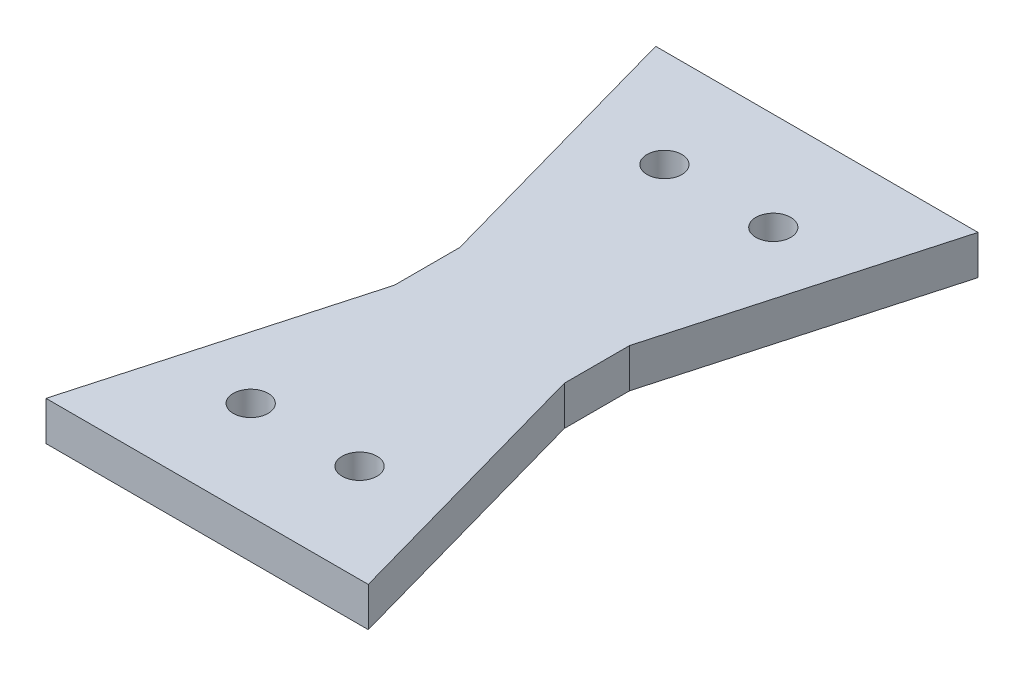
ISO-10303-21;
HEADER;
FILE_DESCRIPTION(('STEP AP214'),'2;1');
FILE_NAME('part.step','',(''),(''),'','','');
FILE_SCHEMA(('AUTOMOTIVE_DESIGN { 1 0 10303 214 1 1 1 1 }'));
ENDSEC;
DATA;
#1=APPLICATION_CONTEXT('core data for automotive mechanical design processes');
#2=APPLICATION_PROTOCOL_DEFINITION('international standard','automotive_design',2000,#1);
#3=PRODUCT_CONTEXT('',#1,'mechanical');
#4=PRODUCT('Part','Part','',(#3));
#5=PRODUCT_RELATED_PRODUCT_CATEGORY('part','',(#4));
#6=PRODUCT_DEFINITION_FORMATION('','',#4);
#7=PRODUCT_DEFINITION_CONTEXT('part definition',#1,'design');
#8=PRODUCT_DEFINITION('design','',#6,#7);
#9=PRODUCT_DEFINITION_SHAPE('','',#8);
#10=(LENGTH_UNIT() NAMED_UNIT(*) SI_UNIT(.MILLI.,.METRE.));
#11=(NAMED_UNIT(*) PLANE_ANGLE_UNIT() SI_UNIT($,.RADIAN.));
#12=(NAMED_UNIT(*) SI_UNIT($,.STERADIAN.) SOLID_ANGLE_UNIT());
#13=UNCERTAINTY_MEASURE_WITH_UNIT(LENGTH_MEASURE(1.E-05),#10,'distance_accuracy_value','');
#14=(GEOMETRIC_REPRESENTATION_CONTEXT(3) GLOBAL_UNCERTAINTY_ASSIGNED_CONTEXT((#13)) GLOBAL_UNIT_ASSIGNED_CONTEXT((#10,
#11,#12)) REPRESENTATION_CONTEXT('',''));
#15=CARTESIAN_POINT('',(0.,0.,0.));
#16=DIRECTION('',(0.,0.,1.));
#17=DIRECTION('',(1.,0.,0.));
#18=AXIS2_PLACEMENT_3D('',#15,#16,#17);
#19=CARTESIAN_POINT('',(0.,9.00000000000001,0.));
#20=DIRECTION('',(0.,-1.,0.));
#21=DIRECTION('',(0.,0.,-1.));
#22=AXIS2_PLACEMENT_3D('',#19,#20,#21);
#23=PLANE('',#22);
#24=DIRECTION('',(-1.,0.,0.));
#25=VECTOR('',#24,1.);
#26=CARTESIAN_POINT('',(-37.,9.00000000000001,-70.));
#27=LINE('',#26,#25);
#28=CARTESIAN_POINT('',(37.,9.00000000000001,-70.));
#29=VERTEX_POINT('',#28);
#30=CARTESIAN_POINT('',(-37.,9.00000000000001,-70.));
#31=VERTEX_POINT('',#30);
#32=EDGE_CURVE('E174',#29,#31,#27,.T.);
#33=ORIENTED_EDGE('',*,*,#32,.T.);
#34=DIRECTION('',(0.26962992551997,0.,0.962964019714182));
#35=VECTOR('',#34,1.);
#36=CARTESIAN_POINT('',(-37.,9.00000000000001,-70.));
#37=LINE('',#36,#35);
#38=CARTESIAN_POINT('',(-19.5,9.00000000000001,-7.50000000000001));
#39=VERTEX_POINT('',#38);
#40=EDGE_CURVE('E104',#31,#39,#37,.T.);
#41=ORIENTED_EDGE('',*,*,#40,.T.);
#42=DIRECTION('',(0.,0.,1.));
#43=VECTOR('',#42,1.);
#44=CARTESIAN_POINT('',(-19.5,9.00000000000001,-7.50000000000001));
#45=LINE('',#44,#43);
#46=CARTESIAN_POINT('',(-19.5,9.00000000000001,7.50000000000001));
#47=VERTEX_POINT('',#46);
#48=EDGE_CURVE('E196',#39,#47,#45,.T.);
#49=ORIENTED_EDGE('',*,*,#48,.T.);
#50=DIRECTION('',(-0.26962992551997,0.,0.962964019714182));
#51=VECTOR('',#50,1.);
#52=CARTESIAN_POINT('',(-30.,9.00000000000001,45.));
#53=LINE('',#52,#51);
#54=CARTESIAN_POINT('',(-37.,9.00000000000001,70.));
#55=VERTEX_POINT('',#54);
#56=EDGE_CURVE('E207',#47,#55,#53,.T.);
#57=ORIENTED_EDGE('',*,*,#56,.T.);
#58=DIRECTION('',(1.,0.,0.));
#59=VECTOR('',#58,1.);
#60=CARTESIAN_POINT('',(-37.,9.00000000000001,70.));
#61=LINE('',#60,#59);
#62=CARTESIAN_POINT('',(37.,9.00000000000001,70.));
#63=VERTEX_POINT('',#62);
#64=EDGE_CURVE('E124',#55,#63,#61,.T.);
#65=ORIENTED_EDGE('',*,*,#64,.T.);
#66=DIRECTION('',(-0.26962992551997,0.,-0.962964019714182));
#67=VECTOR('',#66,1.);
#68=CARTESIAN_POINT('',(37.,9.00000000000001,70.));
#69=LINE('',#68,#67);
#70=CARTESIAN_POINT('',(19.5,9.00000000000001,7.50000000000001));
#71=VERTEX_POINT('',#70);
#72=EDGE_CURVE('E117',#63,#71,#69,.T.);
#73=ORIENTED_EDGE('',*,*,#72,.T.);
#74=DIRECTION('',(0.,0.,-1.));
#75=VECTOR('',#74,1.);
#76=CARTESIAN_POINT('',(19.5,9.00000000000001,-7.50000000000001));
#77=LINE('',#76,#75);
#78=CARTESIAN_POINT('',(19.5,9.00000000000001,-7.50000000000001));
#79=VERTEX_POINT('',#78);
#80=EDGE_CURVE('E121',#71,#79,#77,.T.);
#81=ORIENTED_EDGE('',*,*,#80,.T.);
#82=DIRECTION('',(0.26962992551997,0.,-0.962964019714182));
#83=VECTOR('',#82,1.);
#84=CARTESIAN_POINT('',(30.,9.00000000000001,-45.));
#85=LINE('',#84,#83);
#86=EDGE_CURVE('E63',#79,#29,#85,.T.);
#87=ORIENTED_EDGE('',*,*,#86,.T.);
#88=EDGE_LOOP('',(#33,#41,#49,#57,#65,#73,#81,#87));
#89=FACE_BOUND('',#88,.T.);
#90=CARTESIAN_POINT('',(-12.5,9.00000000000001,-47.5));
#91=DIRECTION('',(0.,1.,0.));
#92=DIRECTION('',(0.,0.,1.));
#93=AXIS2_PLACEMENT_3D('',#90,#91,#92);
#94=CIRCLE('',#93,4.00000000000001);
#95=CARTESIAN_POINT('',(-12.5,9.00000000000001,-43.5));
#96=VERTEX_POINT('',#95);
#97=EDGE_CURVE('E153',#96,#96,#94,.T.);
#98=ORIENTED_EDGE('',*,*,#97,.F.);
#99=EDGE_LOOP('',(#98));
#100=FACE_BOUND('',#99,.T.);
#101=CARTESIAN_POINT('',(12.5,9.00000000000001,-47.5));
#102=DIRECTION('',(0.,1.,0.));
#103=DIRECTION('',(0.,0.,-1.));
#104=AXIS2_PLACEMENT_3D('',#101,#102,#103);
#105=CIRCLE('',#104,4.00000000000001);
#106=CARTESIAN_POINT('',(12.5,9.00000000000001,-51.5));
#107=VERTEX_POINT('',#106);
#108=EDGE_CURVE('E222',#107,#107,#105,.T.);
#109=ORIENTED_EDGE('',*,*,#108,.F.);
#110=EDGE_LOOP('',(#109));
#111=FACE_BOUND('',#110,.T.);
#112=CARTESIAN_POINT('',(12.5,9.00000000000001,47.5));
#113=DIRECTION('',(0.,1.,0.));
#114=DIRECTION('',(0.,0.,1.));
#115=AXIS2_PLACEMENT_3D('',#112,#113,#114);
#116=CIRCLE('',#115,4.00000000000001);
#117=CARTESIAN_POINT('',(12.5,9.00000000000001,51.5));
#118=VERTEX_POINT('',#117);
#119=EDGE_CURVE('E230',#118,#118,#116,.T.);
#120=ORIENTED_EDGE('',*,*,#119,.F.);
#121=EDGE_LOOP('',(#120));
#122=FACE_BOUND('',#121,.T.);
#123=CARTESIAN_POINT('',(-12.5,9.00000000000001,47.5));
#124=DIRECTION('',(0.,1.,0.));
#125=DIRECTION('',(0.,0.,-1.));
#126=AXIS2_PLACEMENT_3D('',#123,#124,#125);
#127=CIRCLE('',#126,4.00000000000001);
#128=CARTESIAN_POINT('',(-12.5,9.00000000000001,43.5));
#129=VERTEX_POINT('',#128);
#130=EDGE_CURVE('E238',#129,#129,#127,.T.);
#131=ORIENTED_EDGE('',*,*,#130,.F.);
#132=EDGE_LOOP('',(#131));
#133=FACE_BOUND('',#132,.T.);
#134=ADVANCED_FACE('F45',(#89,#100,#111,#122,#133),#23,.F.);
#135=CARTESIAN_POINT('',(0.,0.,0.));
#136=DIRECTION('',(0.,-1.,0.));
#137=DIRECTION('',(0.,0.,-1.));
#138=AXIS2_PLACEMENT_3D('',#135,#136,#137);
#139=PLANE('',#138);
#140=CARTESIAN_POINT('',(12.5,0.,47.5));
#141=DIRECTION('',(0.,1.,0.));
#142=DIRECTION('',(0.,0.,1.));
#143=AXIS2_PLACEMENT_3D('',#140,#141,#142);
#144=CIRCLE('',#143,4.00000000000001);
#145=CARTESIAN_POINT('',(12.5,0.,51.5));
#146=VERTEX_POINT('',#145);
#147=EDGE_CURVE('E234',#146,#146,#144,.T.);
#148=ORIENTED_EDGE('',*,*,#147,.T.);
#149=EDGE_LOOP('',(#148));
#150=FACE_BOUND('',#149,.T.);
#151=CARTESIAN_POINT('',(-12.5,0.,-47.5));
#152=DIRECTION('',(0.,1.,0.));
#153=DIRECTION('',(0.,0.,1.));
#154=AXIS2_PLACEMENT_3D('',#151,#152,#153);
#155=CIRCLE('',#154,4.00000000000001);
#156=CARTESIAN_POINT('',(-12.5,0.,-43.5));
#157=VERTEX_POINT('',#156);
#158=EDGE_CURVE('E218',#157,#157,#155,.T.);
#159=ORIENTED_EDGE('',*,*,#158,.T.);
#160=EDGE_LOOP('',(#159));
#161=FACE_BOUND('',#160,.T.);
#162=DIRECTION('',(-1.,0.,0.));
#163=VECTOR('',#162,1.);
#164=CARTESIAN_POINT('',(-37.,0.,-70.));
#165=LINE('',#164,#163);
#166=CARTESIAN_POINT('',(37.,0.,-70.));
#167=VERTEX_POINT('',#166);
#168=CARTESIAN_POINT('',(-37.,0.,-70.));
#169=VERTEX_POINT('',#168);
#170=EDGE_CURVE('E148',#167,#169,#165,.T.);
#171=ORIENTED_EDGE('',*,*,#170,.F.);
#172=DIRECTION('',(0.26962992551997,0.,-0.962964019714182));
#173=VECTOR('',#172,1.);
#174=CARTESIAN_POINT('',(37.,0.,-70.));
#175=LINE('',#174,#173);
#176=CARTESIAN_POINT('',(19.5,0.,-7.50000000000001));
#177=VERTEX_POINT('',#176);
#178=EDGE_CURVE('E92',#177,#167,#175,.T.);
#179=ORIENTED_EDGE('',*,*,#178,.F.);
#180=DIRECTION('',(0.,0.,-1.));
#181=VECTOR('',#180,1.);
#182=CARTESIAN_POINT('',(19.5,0.,-7.50000000000001));
#183=LINE('',#182,#181);
#184=CARTESIAN_POINT('',(19.5,0.,7.50000000000001));
#185=VERTEX_POINT('',#184);
#186=EDGE_CURVE('E169',#185,#177,#183,.T.);
#187=ORIENTED_EDGE('',*,*,#186,.F.);
#188=DIRECTION('',(-0.26962992551997,0.,-0.962964019714182));
#189=VECTOR('',#188,1.);
#190=CARTESIAN_POINT('',(30.,0.,45.));
#191=LINE('',#190,#189);
#192=CARTESIAN_POINT('',(37.,0.,70.));
#193=VERTEX_POINT('',#192);
#194=EDGE_CURVE('E133',#193,#185,#191,.T.);
#195=ORIENTED_EDGE('',*,*,#194,.F.);
#196=DIRECTION('',(1.,0.,0.));
#197=VECTOR('',#196,1.);
#198=CARTESIAN_POINT('',(-37.,0.,70.));
#199=LINE('',#198,#197);
#200=CARTESIAN_POINT('',(-37.,0.,70.));
#201=VERTEX_POINT('',#200);
#202=EDGE_CURVE('E163',#201,#193,#199,.T.);
#203=ORIENTED_EDGE('',*,*,#202,.F.);
#204=DIRECTION('',(-0.26962992551997,0.,0.962964019714182));
#205=VECTOR('',#204,1.);
#206=CARTESIAN_POINT('',(-37.,0.,70.));
#207=LINE('',#206,#205);
#208=CARTESIAN_POINT('',(-19.5,0.,7.50000000000001));
#209=VERTEX_POINT('',#208);
#210=EDGE_CURVE('E160',#209,#201,#207,.T.);
#211=ORIENTED_EDGE('',*,*,#210,.F.);
#212=DIRECTION('',(0.,0.,1.));
#213=VECTOR('',#212,1.);
#214=CARTESIAN_POINT('',(-19.5,0.,-7.50000000000001));
#215=LINE('',#214,#213);
#216=CARTESIAN_POINT('',(-19.5,0.,-7.50000000000001));
#217=VERTEX_POINT('',#216);
#218=EDGE_CURVE('E156',#217,#209,#215,.T.);
#219=ORIENTED_EDGE('',*,*,#218,.F.);
#220=DIRECTION('',(0.26962992551997,0.,0.962964019714182));
#221=VECTOR('',#220,1.);
#222=CARTESIAN_POINT('',(-30.,0.,-45.));
#223=LINE('',#222,#221);
#224=EDGE_CURVE('E152',#169,#217,#223,.T.);
#225=ORIENTED_EDGE('',*,*,#224,.F.);
#226=EDGE_LOOP('',(#171,#179,#187,#195,#203,#211,#219,#225));
#227=FACE_BOUND('',#226,.T.);
#228=CARTESIAN_POINT('',(12.5,0.,-47.5));
#229=DIRECTION('',(0.,1.,0.));
#230=DIRECTION('',(0.,0.,-1.));
#231=AXIS2_PLACEMENT_3D('',#228,#229,#230);
#232=CIRCLE('',#231,4.00000000000001);
#233=CARTESIAN_POINT('',(12.5,0.,-51.5));
#234=VERTEX_POINT('',#233);
#235=EDGE_CURVE('E226',#234,#234,#232,.T.);
#236=ORIENTED_EDGE('',*,*,#235,.T.);
#237=EDGE_LOOP('',(#236));
#238=FACE_BOUND('',#237,.T.);
#239=CARTESIAN_POINT('',(-12.5,0.,47.5));
#240=DIRECTION('',(0.,1.,0.));
#241=DIRECTION('',(0.,0.,-1.));
#242=AXIS2_PLACEMENT_3D('',#239,#240,#241);
#243=CIRCLE('',#242,4.00000000000001);
#244=CARTESIAN_POINT('',(-12.5,0.,43.5));
#245=VERTEX_POINT('',#244);
#246=EDGE_CURVE('E242',#245,#245,#243,.T.);
#247=ORIENTED_EDGE('',*,*,#246,.T.);
#248=EDGE_LOOP('',(#247));
#249=FACE_BOUND('',#248,.T.);
#250=ADVANCED_FACE('F197',(#150,#161,#227,#238,#249),#139,.T.);
#251=CARTESIAN_POINT('',(-37.,9.00000000000001,-70.));
#252=DIRECTION('',(0.,0.,1.));
#253=DIRECTION('',(1.,0.,0.));
#254=AXIS2_PLACEMENT_3D('',#251,#252,#253);
#255=PLANE('',#254);
#256=ORIENTED_EDGE('',*,*,#170,.T.);
#257=DIRECTION('',(0.,-1.,0.));
#258=VECTOR('',#257,1.);
#259=CARTESIAN_POINT('',(-37.,9.00000000000001,-70.));
#260=LINE('',#259,#258);
#261=EDGE_CURVE('E11',#31,#169,#260,.T.);
#262=ORIENTED_EDGE('',*,*,#261,.F.);
#263=ORIENTED_EDGE('',*,*,#32,.F.);
#264=DIRECTION('',(0.,-1.,0.));
#265=VECTOR('',#264,1.);
#266=CARTESIAN_POINT('',(37.,9.00000000000001,-70.));
#267=LINE('',#266,#265);
#268=EDGE_CURVE('E144',#29,#167,#267,.T.);
#269=ORIENTED_EDGE('',*,*,#268,.T.);
#270=EDGE_LOOP('',(#256,#262,#263,#269));
#271=FACE_BOUND('',#270,.T.);
#272=ADVANCED_FACE('F47',(#271),#255,.F.);
#273=CARTESIAN_POINT('',(-30.,9.00000000000001,-45.));
#274=DIRECTION('',(0.962964019714182,0.,-0.26962992551997));
#275=DIRECTION('',(-0.26962992551997,0.,-0.962964019714182));
#276=AXIS2_PLACEMENT_3D('',#273,#274,#275);
#277=PLANE('',#276);
#278=ORIENTED_EDGE('',*,*,#224,.T.);
#279=DIRECTION('',(0.,-1.,0.));
#280=VECTOR('',#279,1.);
#281=CARTESIAN_POINT('',(-19.5,9.00000000000001,-7.50000000000001));
#282=LINE('',#281,#280);
#283=EDGE_CURVE('E55',#39,#217,#282,.T.);
#284=ORIENTED_EDGE('',*,*,#283,.F.);
#285=ORIENTED_EDGE('',*,*,#40,.F.);
#286=ORIENTED_EDGE('',*,*,#261,.T.);
#287=EDGE_LOOP('',(#278,#284,#285,#286));
#288=FACE_BOUND('',#287,.T.);
#289=ADVANCED_FACE('F277',(#288),#277,.F.);
#290=CARTESIAN_POINT('',(-19.5,9.00000000000001,-7.50000000000001));
#291=DIRECTION('',(1.,0.,0.));
#292=DIRECTION('',(0.,0.,-1.));
#293=AXIS2_PLACEMENT_3D('',#290,#291,#292);
#294=PLANE('',#293);
#295=ORIENTED_EDGE('',*,*,#218,.T.);
#296=DIRECTION('',(0.,-1.,0.));
#297=VECTOR('',#296,1.);
#298=CARTESIAN_POINT('',(-19.5,9.00000000000001,7.50000000000001));
#299=LINE('',#298,#297);
#300=EDGE_CURVE('E185',#47,#209,#299,.T.);
#301=ORIENTED_EDGE('',*,*,#300,.F.);
#302=ORIENTED_EDGE('',*,*,#48,.F.);
#303=ORIENTED_EDGE('',*,*,#283,.T.);
#304=EDGE_LOOP('',(#295,#301,#302,#303));
#305=FACE_BOUND('',#304,.T.);
#306=ADVANCED_FACE('F194',(#305),#294,.F.);
#307=CARTESIAN_POINT('',(-37.,9.00000000000001,70.));
#308=DIRECTION('',(0.962964019714182,0.,0.26962992551997));
#309=DIRECTION('',(0.26962992551997,0.,-0.962964019714182));
#310=AXIS2_PLACEMENT_3D('',#307,#308,#309);
#311=PLANE('',#310);
#312=ORIENTED_EDGE('',*,*,#210,.T.);
#313=DIRECTION('',(0.,-1.,0.));
#314=VECTOR('',#313,1.);
#315=CARTESIAN_POINT('',(-37.,9.00000000000001,70.));
#316=LINE('',#315,#314);
#317=EDGE_CURVE('E181',#55,#201,#316,.T.);
#318=ORIENTED_EDGE('',*,*,#317,.F.);
#319=ORIENTED_EDGE('',*,*,#56,.F.);
#320=ORIENTED_EDGE('',*,*,#300,.T.);
#321=EDGE_LOOP('',(#312,#318,#319,#320));
#322=FACE_BOUND('',#321,.T.);
#323=ADVANCED_FACE('F202',(#322),#311,.F.);
#324=CARTESIAN_POINT('',(-37.,9.00000000000001,70.));
#325=DIRECTION('',(0.,0.,-1.));
#326=DIRECTION('',(-1.,0.,0.));
#327=AXIS2_PLACEMENT_3D('',#324,#325,#326);
#328=PLANE('',#327);
#329=ORIENTED_EDGE('',*,*,#202,.T.);
#330=DIRECTION('',(0.,-1.,0.));
#331=VECTOR('',#330,1.);
#332=CARTESIAN_POINT('',(37.,9.00000000000001,70.));
#333=LINE('',#332,#331);
#334=EDGE_CURVE('E136',#63,#193,#333,.T.);
#335=ORIENTED_EDGE('',*,*,#334,.F.);
#336=ORIENTED_EDGE('',*,*,#64,.F.);
#337=ORIENTED_EDGE('',*,*,#317,.T.);
#338=EDGE_LOOP('',(#329,#335,#336,#337));
#339=FACE_BOUND('',#338,.T.);
#340=ADVANCED_FACE('F205',(#339),#328,.F.);
#341=CARTESIAN_POINT('',(30.,9.00000000000001,45.));
#342=DIRECTION('',(-0.962964019714182,0.,0.26962992551997));
#343=DIRECTION('',(0.26962992551997,0.,0.962964019714182));
#344=AXIS2_PLACEMENT_3D('',#341,#342,#343);
#345=PLANE('',#344);
#346=ORIENTED_EDGE('',*,*,#194,.T.);
#347=DIRECTION('',(0.,-1.,0.));
#348=VECTOR('',#347,1.);
#349=CARTESIAN_POINT('',(19.5,9.00000000000001,7.50000000000001));
#350=LINE('',#349,#348);
#351=EDGE_CURVE('E131',#71,#185,#350,.T.);
#352=ORIENTED_EDGE('',*,*,#351,.F.);
#353=ORIENTED_EDGE('',*,*,#72,.F.);
#354=ORIENTED_EDGE('',*,*,#334,.T.);
#355=EDGE_LOOP('',(#346,#352,#353,#354));
#356=FACE_BOUND('',#355,.T.);
#357=ADVANCED_FACE('F132',(#356),#345,.F.);
#358=CARTESIAN_POINT('',(19.5,9.00000000000001,-7.50000000000001));
#359=DIRECTION('',(-1.,0.,0.));
#360=DIRECTION('',(0.,0.,1.));
#361=AXIS2_PLACEMENT_3D('',#358,#359,#360);
#362=PLANE('',#361);
#363=ORIENTED_EDGE('',*,*,#186,.T.);
#364=DIRECTION('',(0.,-1.,0.));
#365=VECTOR('',#364,1.);
#366=CARTESIAN_POINT('',(19.5,9.00000000000001,-7.50000000000001));
#367=LINE('',#366,#365);
#368=EDGE_CURVE('E137',#79,#177,#367,.T.);
#369=ORIENTED_EDGE('',*,*,#368,.F.);
#370=ORIENTED_EDGE('',*,*,#80,.F.);
#371=ORIENTED_EDGE('',*,*,#351,.T.);
#372=EDGE_LOOP('',(#363,#369,#370,#371));
#373=FACE_BOUND('',#372,.T.);
#374=ADVANCED_FACE('F139',(#373),#362,.F.);
#375=CARTESIAN_POINT('',(37.,9.00000000000001,-70.));
#376=DIRECTION('',(-0.962964019714182,0.,-0.26962992551997));
#377=DIRECTION('',(-0.26962992551997,0.,0.962964019714182));
#378=AXIS2_PLACEMENT_3D('',#375,#376,#377);
#379=PLANE('',#378);
#380=ORIENTED_EDGE('',*,*,#178,.T.);
#381=ORIENTED_EDGE('',*,*,#268,.F.);
#382=ORIENTED_EDGE('',*,*,#86,.F.);
#383=ORIENTED_EDGE('',*,*,#368,.T.);
#384=EDGE_LOOP('',(#380,#381,#382,#383));
#385=FACE_BOUND('',#384,.T.);
#386=ADVANCED_FACE('F265',(#385),#379,.F.);
#387=CARTESIAN_POINT('',(-12.5,9.00000000000001,-47.5));
#388=DIRECTION('',(0.,-1.,0.));
#389=DIRECTION('',(0.,0.,-1.));
#390=AXIS2_PLACEMENT_3D('',#387,#388,#389);
#391=CYLINDRICAL_SURFACE('',#390,4.00000000000001);
#392=ORIENTED_EDGE('',*,*,#97,.T.);
#393=EDGE_LOOP('',(#392));
#394=FACE_BOUND('',#393,.T.);
#395=ORIENTED_EDGE('',*,*,#158,.F.);
#396=EDGE_LOOP('',(#395));
#397=FACE_BOUND('',#396,.T.);
#398=ADVANCED_FACE('F262',(#394,#397),#391,.F.);
#399=CARTESIAN_POINT('',(12.5,9.00000000000001,-47.5));
#400=DIRECTION('',(0.,-1.,0.));
#401=DIRECTION('',(0.,0.,-1.));
#402=AXIS2_PLACEMENT_3D('',#399,#400,#401);
#403=CYLINDRICAL_SURFACE('',#402,4.00000000000001);
#404=ORIENTED_EDGE('',*,*,#108,.T.);
#405=EDGE_LOOP('',(#404));
#406=FACE_BOUND('',#405,.T.);
#407=ORIENTED_EDGE('',*,*,#235,.F.);
#408=EDGE_LOOP('',(#407));
#409=FACE_BOUND('',#408,.T.);
#410=ADVANCED_FACE('F366',(#406,#409),#403,.F.);
#411=CARTESIAN_POINT('',(12.5,9.00000000000001,47.5));
#412=DIRECTION('',(0.,-1.,0.));
#413=DIRECTION('',(0.,0.,-1.));
#414=AXIS2_PLACEMENT_3D('',#411,#412,#413);
#415=CYLINDRICAL_SURFACE('',#414,4.00000000000001);
#416=ORIENTED_EDGE('',*,*,#119,.T.);
#417=EDGE_LOOP('',(#416));
#418=FACE_BOUND('',#417,.T.);
#419=ORIENTED_EDGE('',*,*,#147,.F.);
#420=EDGE_LOOP('',(#419));
#421=FACE_BOUND('',#420,.T.);
#422=ADVANCED_FACE('F375',(#418,#421),#415,.F.);
#423=CARTESIAN_POINT('',(-12.5,9.00000000000001,47.5));
#424=DIRECTION('',(0.,-1.,0.));
#425=DIRECTION('',(0.,0.,-1.));
#426=AXIS2_PLACEMENT_3D('',#423,#424,#425);
#427=CYLINDRICAL_SURFACE('',#426,4.00000000000001);
#428=ORIENTED_EDGE('',*,*,#130,.T.);
#429=EDGE_LOOP('',(#428));
#430=FACE_BOUND('',#429,.T.);
#431=ORIENTED_EDGE('',*,*,#246,.F.);
#432=EDGE_LOOP('',(#431));
#433=FACE_BOUND('',#432,.T.);
#434=ADVANCED_FACE('F251',(#430,#433),#427,.F.);
#435=CLOSED_SHELL('',(#134,#250,#272,#289,#306,#323,#340,#357,#374,#386,#398,#410,#422,#434));
#436=MANIFOLD_SOLID_BREP('B2',#435);
#437=ADVANCED_BREP_SHAPE_REPRESENTATION('',(#18,#436),#14);
#438=SHAPE_DEFINITION_REPRESENTATION(#9,#437);
ENDSEC;
END-ISO-10303-21;
